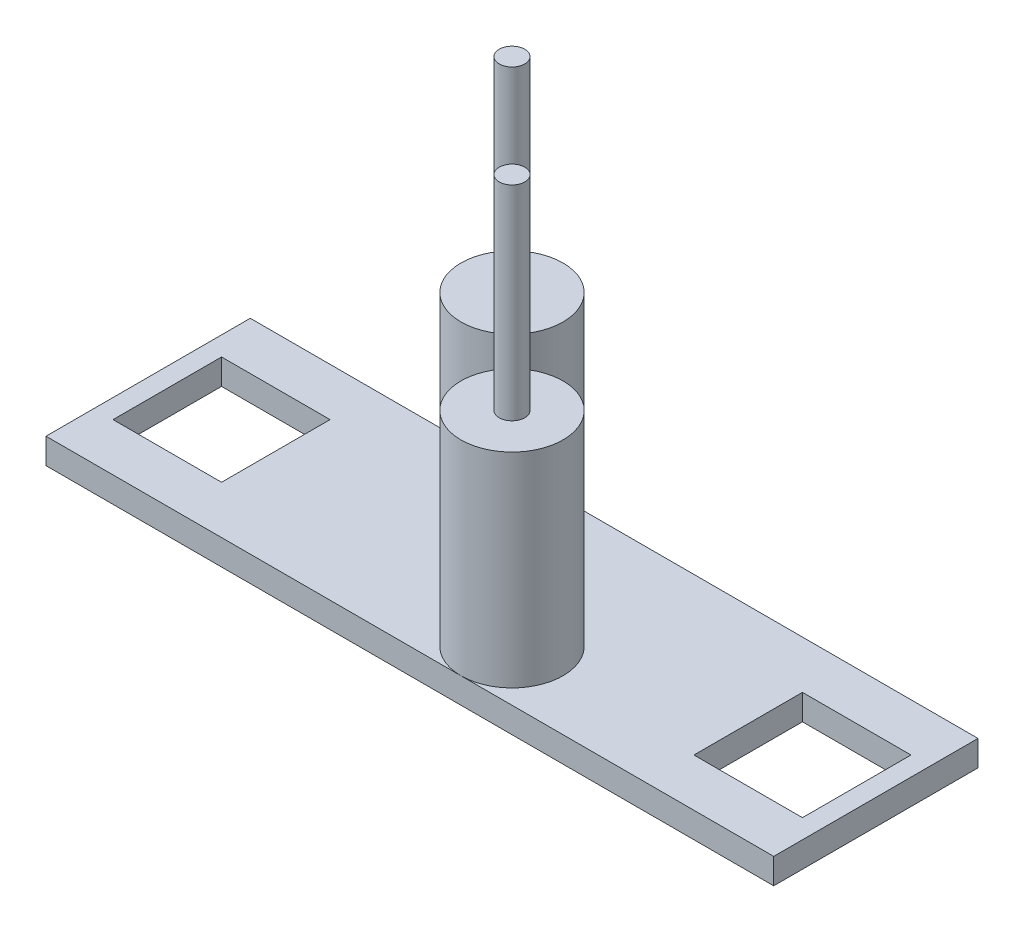
ISO-10303-21;
HEADER;
FILE_DESCRIPTION(('STEP AP214'),'2;1');
FILE_NAME('part.step','',(''),(''),'','','');
FILE_SCHEMA(('AUTOMOTIVE_DESIGN { 1 0 10303 214 1 1 1 1 }'));
ENDSEC;
DATA;
#1=APPLICATION_CONTEXT('core data for automotive mechanical design processes');
#2=APPLICATION_PROTOCOL_DEFINITION('international standard','automotive_design',2000,#1);
#3=PRODUCT_CONTEXT('',#1,'mechanical');
#4=PRODUCT('Part','Part','',(#3));
#5=PRODUCT_RELATED_PRODUCT_CATEGORY('part','',(#4));
#6=PRODUCT_DEFINITION_FORMATION('','',#4);
#7=PRODUCT_DEFINITION_CONTEXT('part definition',#1,'design');
#8=PRODUCT_DEFINITION('design','',#6,#7);
#9=PRODUCT_DEFINITION_SHAPE('','',#8);
#10=(LENGTH_UNIT() NAMED_UNIT(*) SI_UNIT(.MILLI.,.METRE.));
#11=(NAMED_UNIT(*) PLANE_ANGLE_UNIT() SI_UNIT($,.RADIAN.));
#12=(NAMED_UNIT(*) SI_UNIT($,.STERADIAN.) SOLID_ANGLE_UNIT());
#13=UNCERTAINTY_MEASURE_WITH_UNIT(LENGTH_MEASURE(1.E-05),#10,'distance_accuracy_value','');
#14=(GEOMETRIC_REPRESENTATION_CONTEXT(3) GLOBAL_UNCERTAINTY_ASSIGNED_CONTEXT((#13)) GLOBAL_UNIT_ASSIGNED_CONTEXT((#10,
#11,#12)) REPRESENTATION_CONTEXT('',''));
#15=CARTESIAN_POINT('',(0.,0.,0.));
#16=DIRECTION('',(0.,0.,1.));
#17=DIRECTION('',(1.,0.,0.));
#18=AXIS2_PLACEMENT_3D('',#15,#16,#17);
#19=CARTESIAN_POINT('',(0.,6.35,0.));
#20=DIRECTION('',(0.,-1.,0.));
#21=DIRECTION('',(0.,0.,-1.));
#22=AXIS2_PLACEMENT_3D('',#19,#20,#21);
#23=PLANE('',#22);
#24=DIRECTION('',(-1.,0.,0.));
#25=VECTOR('',#24,1.);
#26=CARTESIAN_POINT('',(0.,6.35,50.8));
#27=LINE('',#26,#25);
#28=CARTESIAN_POINT('',(-77.7875,6.35,50.8));
#29=VERTEX_POINT('',#28);
#30=CARTESIAN_POINT('',(-180.975,6.35,50.8));
#31=VERTEX_POINT('',#30);
#32=EDGE_CURVE('E189',#29,#31,#27,.T.);
#33=ORIENTED_EDGE('',*,*,#32,.F.);
#34=CARTESIAN_POINT('',(-77.7875,6.35,38.1));
#35=DIRECTION('',(0.,1.,0.));
#36=DIRECTION('',(0.,0.,1.));
#37=AXIS2_PLACEMENT_3D('',#34,#35,#36);
#38=CIRCLE('',#37,12.7);
#39=EDGE_CURVE('E201',#29,#29,#38,.T.);
#40=ORIENTED_EDGE('',*,*,#39,.F.);
#41=CARTESIAN_POINT('',(0.,6.35,50.8));
#42=VERTEX_POINT('',#41);
#43=EDGE_CURVE('E185',#42,#29,#27,.T.);
#44=ORIENTED_EDGE('',*,*,#43,.F.);
#45=DIRECTION('',(0.,0.,1.));
#46=VECTOR('',#45,1.);
#47=CARTESIAN_POINT('',(0.,6.35,0.));
#48=LINE('',#47,#46);
#49=CARTESIAN_POINT('',(0.,6.35,0.));
#50=VERTEX_POINT('',#49);
#51=EDGE_CURVE('E205',#50,#42,#48,.T.);
#52=ORIENTED_EDGE('',*,*,#51,.F.);
#53=DIRECTION('',(-1.,0.,0.));
#54=VECTOR('',#53,1.);
#55=CARTESIAN_POINT('',(0.,6.35,0.));
#56=LINE('',#55,#54);
#57=CARTESIAN_POINT('',(-103.1875,6.35,0.));
#58=VERTEX_POINT('',#57);
#59=EDGE_CURVE('E214',#50,#58,#56,.T.);
#60=ORIENTED_EDGE('',*,*,#59,.T.);
#61=CARTESIAN_POINT('',(-103.1875,6.35,12.7));
#62=DIRECTION('',(0.,1.,0.));
#63=DIRECTION('',(0.,0.,1.));
#64=AXIS2_PLACEMENT_3D('',#61,#62,#63);
#65=CIRCLE('',#64,12.7);
#66=EDGE_CURVE('E252',#58,#58,#65,.T.);
#67=ORIENTED_EDGE('',*,*,#66,.F.);
#68=CARTESIAN_POINT('',(-180.975,6.35,0.));
#69=VERTEX_POINT('',#68);
#70=EDGE_CURVE('E213',#58,#69,#56,.T.);
#71=ORIENTED_EDGE('',*,*,#70,.T.);
#72=DIRECTION('',(0.,0.,1.));
#73=VECTOR('',#72,1.);
#74=CARTESIAN_POINT('',(-180.975,6.35,0.));
#75=LINE('',#74,#73);
#76=EDGE_CURVE('E197',#69,#31,#75,.T.);
#77=ORIENTED_EDGE('',*,*,#76,.T.);
#78=EDGE_LOOP('',(#33,#40,#44,#52,#60,#67,#71,#77));
#79=FACE_BOUND('',#78,.T.);
#80=DIRECTION('',(0.,0.,1.));
#81=VECTOR('',#80,1.);
#82=CARTESIAN_POINT('',(-176.2125,6.35,11.90625));
#83=LINE('',#82,#81);
#84=CARTESIAN_POINT('',(-176.2125,6.35,11.90625));
#85=VERTEX_POINT('',#84);
#86=CARTESIAN_POINT('',(-176.2125,6.35,38.89375));
#87=VERTEX_POINT('',#86);
#88=EDGE_CURVE('E317',#85,#87,#83,.T.);
#89=ORIENTED_EDGE('',*,*,#88,.F.);
#90=DIRECTION('',(1.,0.,0.));
#91=VECTOR('',#90,1.);
#92=CARTESIAN_POINT('',(-176.2125,6.35,11.90625));
#93=LINE('',#92,#91);
#94=CARTESIAN_POINT('',(-149.225,6.35,11.90625));
#95=VERTEX_POINT('',#94);
#96=EDGE_CURVE('E304',#85,#95,#93,.T.);
#97=ORIENTED_EDGE('',*,*,#96,.T.);
#98=DIRECTION('',(0.,0.,1.));
#99=VECTOR('',#98,1.);
#100=CARTESIAN_POINT('',(-149.225,6.35,11.90625));
#101=LINE('',#100,#99);
#102=CARTESIAN_POINT('',(-149.225,6.35,38.89375));
#103=VERTEX_POINT('',#102);
#104=EDGE_CURVE('E308',#95,#103,#101,.T.);
#105=ORIENTED_EDGE('',*,*,#104,.T.);
#106=DIRECTION('',(1.,0.,0.));
#107=VECTOR('',#106,1.);
#108=CARTESIAN_POINT('',(-176.2125,6.35,38.89375));
#109=LINE('',#108,#107);
#110=EDGE_CURVE('E313',#87,#103,#109,.T.);
#111=ORIENTED_EDGE('',*,*,#110,.F.);
#112=EDGE_LOOP('',(#89,#97,#105,#111));
#113=FACE_BOUND('',#112,.T.);
#114=DIRECTION('',(-1.,0.,0.));
#115=VECTOR('',#114,1.);
#116=CARTESIAN_POINT('',(-4.7625,6.35,11.90625));
#117=LINE('',#116,#115);
#118=CARTESIAN_POINT('',(-4.7625,6.35,11.90625));
#119=VERTEX_POINT('',#118);
#120=CARTESIAN_POINT('',(-31.75,6.35,11.90625));
#121=VERTEX_POINT('',#120);
#122=EDGE_CURVE('E265',#119,#121,#117,.T.);
#123=ORIENTED_EDGE('',*,*,#122,.F.);
#124=DIRECTION('',(0.,0.,1.));
#125=VECTOR('',#124,1.);
#126=CARTESIAN_POINT('',(-4.7625,6.35,11.90625));
#127=LINE('',#126,#125);
#128=CARTESIAN_POINT('',(-4.7625,6.35,38.89375));
#129=VERTEX_POINT('',#128);
#130=EDGE_CURVE('E274',#119,#129,#127,.T.);
#131=ORIENTED_EDGE('',*,*,#130,.T.);
#132=DIRECTION('',(-1.,0.,0.));
#133=VECTOR('',#132,1.);
#134=CARTESIAN_POINT('',(-4.7625,6.35,38.89375));
#135=LINE('',#134,#133);
#136=CARTESIAN_POINT('',(-31.75,6.35,38.89375));
#137=VERTEX_POINT('',#136);
#138=EDGE_CURVE('E105',#129,#137,#135,.T.);
#139=ORIENTED_EDGE('',*,*,#138,.T.);
#140=DIRECTION('',(0.,0.,1.));
#141=VECTOR('',#140,1.);
#142=CARTESIAN_POINT('',(-31.75,6.35,11.90625));
#143=LINE('',#142,#141);
#144=EDGE_CURVE('E268',#121,#137,#143,.T.);
#145=ORIENTED_EDGE('',*,*,#144,.F.);
#146=EDGE_LOOP('',(#123,#131,#139,#145));
#147=FACE_BOUND('',#146,.T.);
#148=ADVANCED_FACE('F87',(#79,#113,#147),#23,.F.);
#149=CARTESIAN_POINT('',(0.,0.,0.));
#150=DIRECTION('',(0.,-1.,0.));
#151=DIRECTION('',(0.,0.,-1.));
#152=AXIS2_PLACEMENT_3D('',#149,#150,#151);
#153=PLANE('',#152);
#154=DIRECTION('',(1.,0.,0.));
#155=VECTOR('',#154,1.);
#156=CARTESIAN_POINT('',(-176.2125,0.,11.90625));
#157=LINE('',#156,#155);
#158=CARTESIAN_POINT('',(-176.2125,0.,11.90625));
#159=VERTEX_POINT('',#158);
#160=CARTESIAN_POINT('',(-149.225,0.,11.90625));
#161=VERTEX_POINT('',#160);
#162=EDGE_CURVE('E303',#159,#161,#157,.T.);
#163=ORIENTED_EDGE('',*,*,#162,.F.);
#164=DIRECTION('',(0.,0.,1.));
#165=VECTOR('',#164,1.);
#166=CARTESIAN_POINT('',(-176.2125,0.,11.90625));
#167=LINE('',#166,#165);
#168=CARTESIAN_POINT('',(-176.2125,0.,38.89375));
#169=VERTEX_POINT('',#168);
#170=EDGE_CURVE('E309',#159,#169,#167,.T.);
#171=ORIENTED_EDGE('',*,*,#170,.T.);
#172=DIRECTION('',(1.,0.,0.));
#173=VECTOR('',#172,1.);
#174=CARTESIAN_POINT('',(-176.2125,0.,38.89375));
#175=LINE('',#174,#173);
#176=CARTESIAN_POINT('',(-149.225,0.,38.89375));
#177=VERTEX_POINT('',#176);
#178=EDGE_CURVE('E327',#169,#177,#175,.T.);
#179=ORIENTED_EDGE('',*,*,#178,.T.);
#180=DIRECTION('',(0.,0.,1.));
#181=VECTOR('',#180,1.);
#182=CARTESIAN_POINT('',(-149.225,0.,11.90625));
#183=LINE('',#182,#181);
#184=EDGE_CURVE('E323',#161,#177,#183,.T.);
#185=ORIENTED_EDGE('',*,*,#184,.F.);
#186=EDGE_LOOP('',(#163,#171,#179,#185));
#187=FACE_BOUND('',#186,.T.);
#188=DIRECTION('',(0.,0.,1.));
#189=VECTOR('',#188,1.);
#190=CARTESIAN_POINT('',(0.,0.,0.));
#191=LINE('',#190,#189);
#192=CARTESIAN_POINT('',(0.,0.,0.));
#193=VERTEX_POINT('',#192);
#194=CARTESIAN_POINT('',(0.,0.,50.8));
#195=VERTEX_POINT('',#194);
#196=EDGE_CURVE('E217',#193,#195,#191,.T.);
#197=ORIENTED_EDGE('',*,*,#196,.T.);
#198=DIRECTION('',(-1.,0.,0.));
#199=VECTOR('',#198,1.);
#200=CARTESIAN_POINT('',(0.,0.,50.8));
#201=LINE('',#200,#199);
#202=CARTESIAN_POINT('',(-180.975,0.,50.8));
#203=VERTEX_POINT('',#202);
#204=EDGE_CURVE('E221',#195,#203,#201,.T.);
#205=ORIENTED_EDGE('',*,*,#204,.T.);
#206=DIRECTION('',(0.,0.,1.));
#207=VECTOR('',#206,1.);
#208=CARTESIAN_POINT('',(-180.975,0.,0.));
#209=LINE('',#208,#207);
#210=CARTESIAN_POINT('',(-180.975,0.,0.));
#211=VERTEX_POINT('',#210);
#212=EDGE_CURVE('E226',#211,#203,#209,.T.);
#213=ORIENTED_EDGE('',*,*,#212,.F.);
#214=DIRECTION('',(-1.,0.,0.));
#215=VECTOR('',#214,1.);
#216=CARTESIAN_POINT('',(0.,0.,0.));
#217=LINE('',#216,#215);
#218=EDGE_CURVE('E207',#193,#211,#217,.T.);
#219=ORIENTED_EDGE('',*,*,#218,.F.);
#220=EDGE_LOOP('',(#197,#205,#213,#219));
#221=FACE_BOUND('',#220,.T.);
#222=DIRECTION('',(0.,0.,1.));
#223=VECTOR('',#222,1.);
#224=CARTESIAN_POINT('',(-4.7625,0.,11.90625));
#225=LINE('',#224,#223);
#226=CARTESIAN_POINT('',(-4.7625,0.,11.90625));
#227=VERTEX_POINT('',#226);
#228=CARTESIAN_POINT('',(-4.7625,0.,38.89375));
#229=VERTEX_POINT('',#228);
#230=EDGE_CURVE('E269',#227,#229,#225,.T.);
#231=ORIENTED_EDGE('',*,*,#230,.F.);
#232=DIRECTION('',(-1.,0.,0.));
#233=VECTOR('',#232,1.);
#234=CARTESIAN_POINT('',(-4.7625,0.,11.90625));
#235=LINE('',#234,#233);
#236=CARTESIAN_POINT('',(-31.75,0.,11.90625));
#237=VERTEX_POINT('',#236);
#238=EDGE_CURVE('E113',#227,#237,#235,.T.);
#239=ORIENTED_EDGE('',*,*,#238,.T.);
#240=DIRECTION('',(0.,0.,1.));
#241=VECTOR('',#240,1.);
#242=CARTESIAN_POINT('',(-31.75,0.,11.90625));
#243=LINE('',#242,#241);
#244=CARTESIAN_POINT('',(-31.75,0.,38.89375));
#245=VERTEX_POINT('',#244);
#246=EDGE_CURVE('E281',#237,#245,#243,.T.);
#247=ORIENTED_EDGE('',*,*,#246,.T.);
#248=DIRECTION('',(-1.,0.,0.));
#249=VECTOR('',#248,1.);
#250=CARTESIAN_POINT('',(-4.7625,0.,38.89375));
#251=LINE('',#250,#249);
#252=EDGE_CURVE('E285',#229,#245,#251,.T.);
#253=ORIENTED_EDGE('',*,*,#252,.F.);
#254=EDGE_LOOP('',(#231,#239,#247,#253));
#255=FACE_BOUND('',#254,.T.);
#256=ADVANCED_FACE('F351',(#187,#221,#255),#153,.T.);
#257=CARTESIAN_POINT('',(0.,6.35,0.));
#258=DIRECTION('',(1.,0.,0.));
#259=DIRECTION('',(0.,0.,-1.));
#260=AXIS2_PLACEMENT_3D('',#257,#258,#259);
#261=PLANE('',#260);
#262=ORIENTED_EDGE('',*,*,#196,.F.);
#263=DIRECTION('',(0.,-1.,0.));
#264=VECTOR('',#263,1.);
#265=CARTESIAN_POINT('',(0.,6.35,0.));
#266=LINE('',#265,#264);
#267=EDGE_CURVE('E12',#50,#193,#266,.T.);
#268=ORIENTED_EDGE('',*,*,#267,.F.);
#269=ORIENTED_EDGE('',*,*,#51,.T.);
#270=DIRECTION('',(0.,-1.,0.));
#271=VECTOR('',#270,1.);
#272=CARTESIAN_POINT('',(0.,6.35,50.8));
#273=LINE('',#272,#271);
#274=EDGE_CURVE('E191',#42,#195,#273,.T.);
#275=ORIENTED_EDGE('',*,*,#274,.T.);
#276=EDGE_LOOP('',(#262,#268,#269,#275));
#277=FACE_BOUND('',#276,.T.);
#278=ADVANCED_FACE('F89',(#277),#261,.T.);
#279=CARTESIAN_POINT('',(0.,6.35,0.));
#280=DIRECTION('',(0.,0.,1.));
#281=DIRECTION('',(1.,0.,0.));
#282=AXIS2_PLACEMENT_3D('',#279,#280,#281);
#283=PLANE('',#282);
#284=ORIENTED_EDGE('',*,*,#218,.T.);
#285=DIRECTION('',(0.,-1.,0.));
#286=VECTOR('',#285,1.);
#287=CARTESIAN_POINT('',(-180.975,6.35,0.));
#288=LINE('',#287,#286);
#289=EDGE_CURVE('E97',#69,#211,#288,.T.);
#290=ORIENTED_EDGE('',*,*,#289,.F.);
#291=ORIENTED_EDGE('',*,*,#70,.F.);
#292=ORIENTED_EDGE('',*,*,#59,.F.);
#293=ORIENTED_EDGE('',*,*,#267,.T.);
#294=EDGE_LOOP('',(#284,#290,#291,#292,#293));
#295=FACE_BOUND('',#294,.T.);
#296=ADVANCED_FACE('F381',(#295),#283,.F.);
#297=CARTESIAN_POINT('',(-180.975,6.35,0.));
#298=DIRECTION('',(1.,0.,0.));
#299=DIRECTION('',(0.,0.,-1.));
#300=AXIS2_PLACEMENT_3D('',#297,#298,#299);
#301=PLANE('',#300);
#302=ORIENTED_EDGE('',*,*,#212,.T.);
#303=DIRECTION('',(0.,-1.,0.));
#304=VECTOR('',#303,1.);
#305=CARTESIAN_POINT('',(-180.975,6.35,50.8));
#306=LINE('',#305,#304);
#307=EDGE_CURVE('E235',#31,#203,#306,.T.);
#308=ORIENTED_EDGE('',*,*,#307,.F.);
#309=ORIENTED_EDGE('',*,*,#76,.F.);
#310=ORIENTED_EDGE('',*,*,#289,.T.);
#311=EDGE_LOOP('',(#302,#308,#309,#310));
#312=FACE_BOUND('',#311,.T.);
#313=ADVANCED_FACE('F384',(#312),#301,.F.);
#314=CARTESIAN_POINT('',(0.,6.35,50.8));
#315=DIRECTION('',(0.,0.,1.));
#316=DIRECTION('',(1.,0.,0.));
#317=AXIS2_PLACEMENT_3D('',#314,#315,#316);
#318=PLANE('',#317);
#319=ORIENTED_EDGE('',*,*,#204,.F.);
#320=ORIENTED_EDGE('',*,*,#274,.F.);
#321=ORIENTED_EDGE('',*,*,#43,.T.);
#322=ORIENTED_EDGE('',*,*,#32,.T.);
#323=ORIENTED_EDGE('',*,*,#307,.T.);
#324=EDGE_LOOP('',(#319,#320,#321,#322,#323));
#325=FACE_BOUND('',#324,.T.);
#326=ADVANCED_FACE('F188',(#325),#318,.T.);
#327=CARTESIAN_POINT('',(-176.2125,6.35,11.90625));
#328=DIRECTION('',(0.,0.,-1.));
#329=DIRECTION('',(-1.,0.,0.));
#330=AXIS2_PLACEMENT_3D('',#327,#328,#329);
#331=PLANE('',#330);
#332=ORIENTED_EDGE('',*,*,#162,.T.);
#333=DIRECTION('',(0.,-1.,0.));
#334=VECTOR('',#333,1.);
#335=CARTESIAN_POINT('',(-149.225,6.35,11.90625));
#336=LINE('',#335,#334);
#337=EDGE_CURVE('E320',#95,#161,#336,.T.);
#338=ORIENTED_EDGE('',*,*,#337,.F.);
#339=ORIENTED_EDGE('',*,*,#96,.F.);
#340=DIRECTION('',(0.,-1.,0.));
#341=VECTOR('',#340,1.);
#342=CARTESIAN_POINT('',(-176.2125,6.35,11.90625));
#343=LINE('',#342,#341);
#344=EDGE_CURVE('E222',#85,#159,#343,.T.);
#345=ORIENTED_EDGE('',*,*,#344,.T.);
#346=EDGE_LOOP('',(#332,#338,#339,#345));
#347=FACE_BOUND('',#346,.T.);
#348=ADVANCED_FACE('F361',(#347),#331,.F.);
#349=CARTESIAN_POINT('',(-176.2125,6.35,11.90625));
#350=DIRECTION('',(1.,0.,0.));
#351=DIRECTION('',(0.,0.,-1.));
#352=AXIS2_PLACEMENT_3D('',#349,#350,#351);
#353=PLANE('',#352);
#354=ORIENTED_EDGE('',*,*,#170,.F.);
#355=ORIENTED_EDGE('',*,*,#344,.F.);
#356=ORIENTED_EDGE('',*,*,#88,.T.);
#357=DIRECTION('',(0.,-1.,0.));
#358=VECTOR('',#357,1.);
#359=CARTESIAN_POINT('',(-176.2125,6.35,38.89375));
#360=LINE('',#359,#358);
#361=EDGE_CURVE('E336',#87,#169,#360,.T.);
#362=ORIENTED_EDGE('',*,*,#361,.T.);
#363=EDGE_LOOP('',(#354,#355,#356,#362));
#364=FACE_BOUND('',#363,.T.);
#365=ADVANCED_FACE('F363',(#364),#353,.T.);
#366=CARTESIAN_POINT('',(-176.2125,6.35,38.89375));
#367=DIRECTION('',(0.,0.,-1.));
#368=DIRECTION('',(-1.,0.,0.));
#369=AXIS2_PLACEMENT_3D('',#366,#367,#368);
#370=PLANE('',#369);
#371=ORIENTED_EDGE('',*,*,#178,.F.);
#372=ORIENTED_EDGE('',*,*,#361,.F.);
#373=ORIENTED_EDGE('',*,*,#110,.T.);
#374=DIRECTION('',(0.,-1.,0.));
#375=VECTOR('',#374,1.);
#376=CARTESIAN_POINT('',(-149.225,6.35,38.89375));
#377=LINE('',#376,#375);
#378=EDGE_CURVE('E339',#103,#177,#377,.T.);
#379=ORIENTED_EDGE('',*,*,#378,.T.);
#380=EDGE_LOOP('',(#371,#372,#373,#379));
#381=FACE_BOUND('',#380,.T.);
#382=ADVANCED_FACE('F357',(#381),#370,.T.);
#383=CARTESIAN_POINT('',(-149.225,6.35,11.90625));
#384=DIRECTION('',(1.,0.,0.));
#385=DIRECTION('',(0.,0.,-1.));
#386=AXIS2_PLACEMENT_3D('',#383,#384,#385);
#387=PLANE('',#386);
#388=ORIENTED_EDGE('',*,*,#184,.T.);
#389=ORIENTED_EDGE('',*,*,#378,.F.);
#390=ORIENTED_EDGE('',*,*,#104,.F.);
#391=ORIENTED_EDGE('',*,*,#337,.T.);
#392=EDGE_LOOP('',(#388,#389,#390,#391));
#393=FACE_BOUND('',#392,.T.);
#394=ADVANCED_FACE('F346',(#393),#387,.F.);
#395=CARTESIAN_POINT('',(-4.7625,6.35,11.90625));
#396=DIRECTION('',(0.,0.,1.));
#397=DIRECTION('',(1.,0.,0.));
#398=AXIS2_PLACEMENT_3D('',#395,#396,#397);
#399=PLANE('',#398);
#400=ORIENTED_EDGE('',*,*,#238,.F.);
#401=DIRECTION('',(0.,-1.,0.));
#402=VECTOR('',#401,1.);
#403=CARTESIAN_POINT('',(-4.7625,6.35,11.90625));
#404=LINE('',#403,#402);
#405=EDGE_CURVE('E278',#119,#227,#404,.T.);
#406=ORIENTED_EDGE('',*,*,#405,.F.);
#407=ORIENTED_EDGE('',*,*,#122,.T.);
#408=DIRECTION('',(0.,-1.,0.));
#409=VECTOR('',#408,1.);
#410=CARTESIAN_POINT('',(-31.75,6.35,11.90625));
#411=LINE('',#410,#409);
#412=EDGE_CURVE('E300',#121,#237,#411,.T.);
#413=ORIENTED_EDGE('',*,*,#412,.T.);
#414=EDGE_LOOP('',(#400,#406,#407,#413));
#415=FACE_BOUND('',#414,.T.);
#416=ADVANCED_FACE('F421',(#415),#399,.T.);
#417=CARTESIAN_POINT('',(-31.75,6.35,11.90625));
#418=DIRECTION('',(1.,0.,0.));
#419=DIRECTION('',(0.,0.,-1.));
#420=AXIS2_PLACEMENT_3D('',#417,#418,#419);
#421=PLANE('',#420);
#422=ORIENTED_EDGE('',*,*,#246,.F.);
#423=ORIENTED_EDGE('',*,*,#412,.F.);
#424=ORIENTED_EDGE('',*,*,#144,.T.);
#425=DIRECTION('',(0.,-1.,0.));
#426=VECTOR('',#425,1.);
#427=CARTESIAN_POINT('',(-31.75,6.35,38.89375));
#428=LINE('',#427,#426);
#429=EDGE_CURVE('E297',#137,#245,#428,.T.);
#430=ORIENTED_EDGE('',*,*,#429,.T.);
#431=EDGE_LOOP('',(#422,#423,#424,#430));
#432=FACE_BOUND('',#431,.T.);
#433=ADVANCED_FACE('F429',(#432),#421,.T.);
#434=CARTESIAN_POINT('',(-4.7625,6.35,38.89375));
#435=DIRECTION('',(0.,0.,1.));
#436=DIRECTION('',(1.,0.,0.));
#437=AXIS2_PLACEMENT_3D('',#434,#435,#436);
#438=PLANE('',#437);
#439=ORIENTED_EDGE('',*,*,#252,.T.);
#440=ORIENTED_EDGE('',*,*,#429,.F.);
#441=ORIENTED_EDGE('',*,*,#138,.F.);
#442=DIRECTION('',(0.,-1.,0.));
#443=VECTOR('',#442,1.);
#444=CARTESIAN_POINT('',(-4.7625,6.35,38.89375));
#445=LINE('',#444,#443);
#446=EDGE_CURVE('E294',#129,#229,#445,.T.);
#447=ORIENTED_EDGE('',*,*,#446,.T.);
#448=EDGE_LOOP('',(#439,#440,#441,#447));
#449=FACE_BOUND('',#448,.T.);
#450=ADVANCED_FACE('F437',(#449),#438,.F.);
#451=CARTESIAN_POINT('',(-4.7625,6.35,11.90625));
#452=DIRECTION('',(1.,0.,0.));
#453=DIRECTION('',(0.,0.,-1.));
#454=AXIS2_PLACEMENT_3D('',#451,#452,#453);
#455=PLANE('',#454);
#456=ORIENTED_EDGE('',*,*,#230,.T.);
#457=ORIENTED_EDGE('',*,*,#446,.F.);
#458=ORIENTED_EDGE('',*,*,#130,.F.);
#459=ORIENTED_EDGE('',*,*,#405,.T.);
#460=EDGE_LOOP('',(#456,#457,#458,#459));
#461=FACE_BOUND('',#460,.T.);
#462=ADVANCED_FACE('F447',(#461),#455,.F.);
#463=CARTESIAN_POINT('',(-103.1875,57.15,12.7));
#464=DIRECTION('',(0.,-1.,0.));
#465=DIRECTION('',(0.,0.,-1.));
#466=AXIS2_PLACEMENT_3D('',#463,#464,#465);
#467=CYLINDRICAL_SURFACE('',#466,12.7);
#468=CARTESIAN_POINT('',(-103.1875,57.15,12.7));
#469=DIRECTION('',(0.,1.,0.));
#470=DIRECTION('',(0.,0.,1.));
#471=AXIS2_PLACEMENT_3D('',#468,#469,#470);
#472=CIRCLE('',#471,12.7);
#473=CARTESIAN_POINT('',(-103.1875,57.15,25.4));
#474=VERTEX_POINT('',#473);
#475=EDGE_CURVE('E243',#474,#474,#472,.T.);
#476=ORIENTED_EDGE('',*,*,#475,.F.);
#477=EDGE_LOOP('',(#476));
#478=FACE_BOUND('',#477,.T.);
#479=ORIENTED_EDGE('',*,*,#66,.T.);
#480=EDGE_LOOP('',(#479));
#481=FACE_BOUND('',#480,.T.);
#482=ADVANCED_FACE('F456',(#478,#481),#467,.T.);
#483=CARTESIAN_POINT('',(-103.1875,57.15,12.7));
#484=DIRECTION('',(0.,1.,0.));
#485=DIRECTION('',(0.,0.,1.));
#486=AXIS2_PLACEMENT_3D('',#483,#484,#485);
#487=PLANE('',#486);
#488=CARTESIAN_POINT('',(-103.1875,57.15,12.7));
#489=DIRECTION('',(0.,1.,0.));
#490=DIRECTION('',(0.,0.,1.));
#491=AXIS2_PLACEMENT_3D('',#488,#489,#490);
#492=CIRCLE('',#491,3.175);
#493=CARTESIAN_POINT('',(-103.1875,57.15,15.875));
#494=VERTEX_POINT('',#493);
#495=EDGE_CURVE('E239',#494,#494,#492,.T.);
#496=ORIENTED_EDGE('',*,*,#495,.F.);
#497=EDGE_LOOP('',(#496));
#498=FACE_BOUND('',#497,.T.);
#499=ORIENTED_EDGE('',*,*,#475,.T.);
#500=EDGE_LOOP('',(#499));
#501=FACE_BOUND('',#500,.T.);
#502=ADVANCED_FACE('F484',(#498,#501),#487,.T.);
#503=CARTESIAN_POINT('',(-103.1875,107.95,12.7));
#504=DIRECTION('',(0.,1.,0.));
#505=DIRECTION('',(0.,0.,1.));
#506=AXIS2_PLACEMENT_3D('',#503,#504,#505);
#507=PLANE('',#506);
#508=CARTESIAN_POINT('',(-103.1875,107.95,12.7));
#509=DIRECTION('',(0.,1.,0.));
#510=DIRECTION('',(0.,0.,1.));
#511=AXIS2_PLACEMENT_3D('',#508,#509,#510);
#512=CIRCLE('',#511,3.175);
#513=CARTESIAN_POINT('',(-103.1875,107.95,15.875));
#514=VERTEX_POINT('',#513);
#515=EDGE_CURVE('E242',#514,#514,#512,.T.);
#516=ORIENTED_EDGE('',*,*,#515,.T.);
#517=EDGE_LOOP('',(#516));
#518=FACE_BOUND('',#517,.T.);
#519=ADVANCED_FACE('F479',(#518),#507,.T.);
#520=CARTESIAN_POINT('',(-103.1875,107.95,12.7));
#521=DIRECTION('',(0.,-1.,0.));
#522=DIRECTION('',(0.,0.,-1.));
#523=AXIS2_PLACEMENT_3D('',#520,#521,#522);
#524=CYLINDRICAL_SURFACE('',#523,3.175);
#525=ORIENTED_EDGE('',*,*,#495,.T.);
#526=EDGE_LOOP('',(#525));
#527=FACE_BOUND('',#526,.T.);
#528=ORIENTED_EDGE('',*,*,#515,.F.);
#529=EDGE_LOOP('',(#528));
#530=FACE_BOUND('',#529,.T.);
#531=ADVANCED_FACE('F483',(#527,#530),#524,.T.);
#532=CARTESIAN_POINT('',(-77.7875,57.15,38.1));
#533=DIRECTION('',(0.,-1.,0.));
#534=DIRECTION('',(0.,0.,-1.));
#535=AXIS2_PLACEMENT_3D('',#532,#533,#534);
#536=CYLINDRICAL_SURFACE('',#535,12.7);
#537=CARTESIAN_POINT('',(-77.7875,57.15,38.1));
#538=DIRECTION('',(0.,1.,0.));
#539=DIRECTION('',(0.,0.,1.));
#540=AXIS2_PLACEMENT_3D('',#537,#538,#539);
#541=CIRCLE('',#540,12.7);
#542=CARTESIAN_POINT('',(-77.7875,57.15,50.8));
#543=VERTEX_POINT('',#542);
#544=EDGE_CURVE('E542',#543,#543,#541,.T.);
#545=ORIENTED_EDGE('',*,*,#544,.F.);
#546=EDGE_LOOP('',(#545));
#547=FACE_BOUND('',#546,.T.);
#548=ORIENTED_EDGE('',*,*,#39,.T.);
#549=EDGE_LOOP('',(#548));
#550=FACE_BOUND('',#549,.T.);
#551=ADVANCED_FACE('F531',(#547,#550),#536,.T.);
#552=CARTESIAN_POINT('',(-77.7875,57.15,38.1));
#553=DIRECTION('',(0.,1.,0.));
#554=DIRECTION('',(0.,0.,1.));
#555=AXIS2_PLACEMENT_3D('',#552,#553,#554);
#556=PLANE('',#555);
#557=CARTESIAN_POINT('',(-77.7875,57.15,38.1));
#558=DIRECTION('',(0.,1.,0.));
#559=DIRECTION('',(0.,0.,1.));
#560=AXIS2_PLACEMENT_3D('',#557,#558,#559);
#561=CIRCLE('',#560,3.175);
#562=CARTESIAN_POINT('',(-77.7875,57.15,41.2749999999999));
#563=VERTEX_POINT('',#562);
#564=EDGE_CURVE('E91',#563,#563,#561,.T.);
#565=ORIENTED_EDGE('',*,*,#564,.F.);
#566=EDGE_LOOP('',(#565));
#567=FACE_BOUND('',#566,.T.);
#568=ORIENTED_EDGE('',*,*,#544,.T.);
#569=EDGE_LOOP('',(#568));
#570=FACE_BOUND('',#569,.T.);
#571=ADVANCED_FACE('F470',(#567,#570),#556,.T.);
#572=CARTESIAN_POINT('',(-77.7875,107.95,38.1));
#573=DIRECTION('',(0.,1.,0.));
#574=DIRECTION('',(0.,0.,1.));
#575=AXIS2_PLACEMENT_3D('',#572,#573,#574);
#576=PLANE('',#575);
#577=CARTESIAN_POINT('',(-77.7875,107.95,38.1));
#578=DIRECTION('',(0.,1.,0.));
#579=DIRECTION('',(0.,0.,1.));
#580=AXIS2_PLACEMENT_3D('',#577,#578,#579);
#581=CIRCLE('',#580,3.175);
#582=CARTESIAN_POINT('',(-77.7875,107.95,41.2749999999999));
#583=VERTEX_POINT('',#582);
#584=EDGE_CURVE('E249',#583,#583,#581,.T.);
#585=ORIENTED_EDGE('',*,*,#584,.T.);
#586=EDGE_LOOP('',(#585));
#587=FACE_BOUND('',#586,.T.);
#588=ADVANCED_FACE('F464',(#587),#576,.T.);
#589=CARTESIAN_POINT('',(-77.7875,107.95,38.1));
#590=DIRECTION('',(0.,-1.,0.));
#591=DIRECTION('',(0.,0.,-1.));
#592=AXIS2_PLACEMENT_3D('',#589,#590,#591);
#593=CYLINDRICAL_SURFACE('',#592,3.175);
#594=ORIENTED_EDGE('',*,*,#564,.T.);
#595=EDGE_LOOP('',(#594));
#596=FACE_BOUND('',#595,.T.);
#597=ORIENTED_EDGE('',*,*,#584,.F.);
#598=EDGE_LOOP('',(#597));
#599=FACE_BOUND('',#598,.T.);
#600=ADVANCED_FACE('F469',(#596,#599),#593,.T.);
#601=CLOSED_SHELL('',(#148,#256,#278,#296,#313,#326,#348,#365,#382,#394,#416,#433,#450,#462,
#482,#502,#519,#531,#551,#571,#588,#600));
#602=MANIFOLD_SOLID_BREP('B2',#601);
#603=ADVANCED_BREP_SHAPE_REPRESENTATION('',(#18,#602),#14);
#604=SHAPE_DEFINITION_REPRESENTATION(#9,#603);
ENDSEC;
END-ISO-10303-21;
